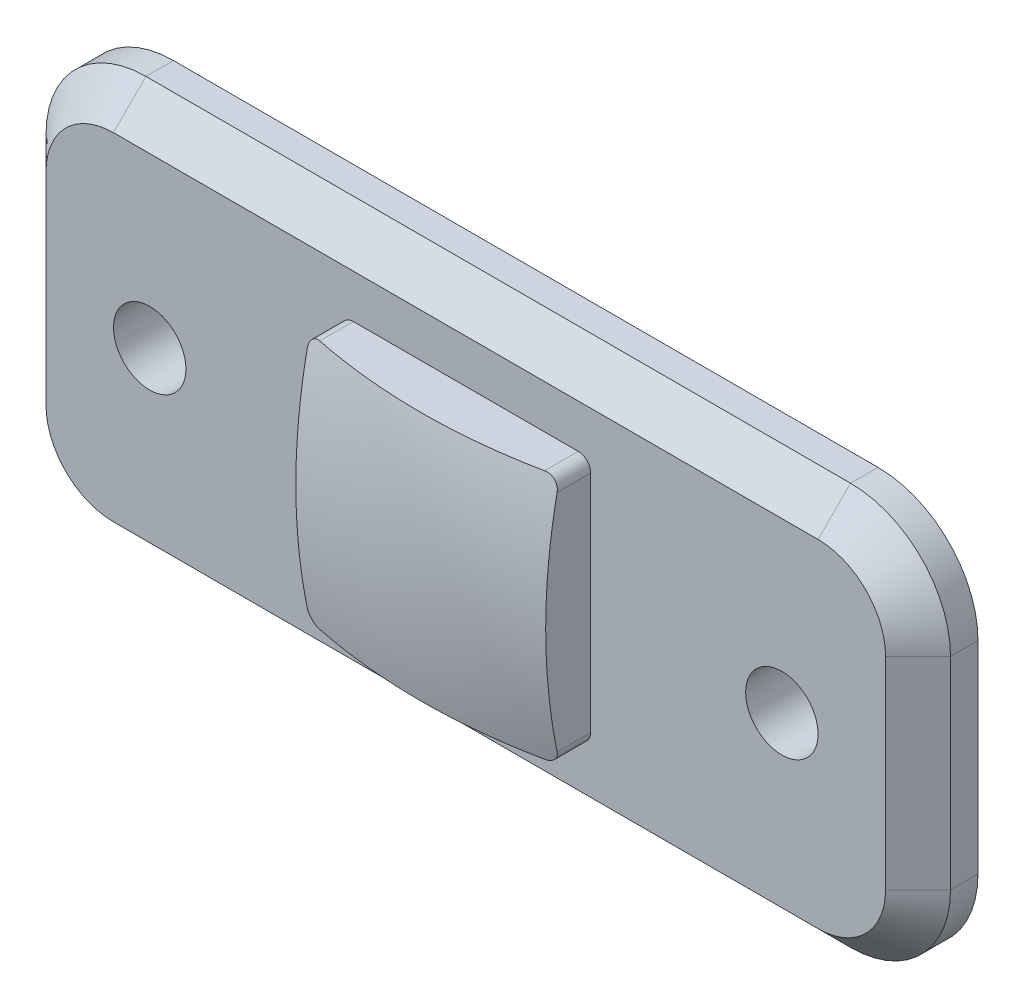
ISO-10303-21;
HEADER;
FILE_DESCRIPTION(('STEP AP214'),'2;1');
FILE_NAME('part.step','',(''),(''),'','','');
FILE_SCHEMA(('AUTOMOTIVE_DESIGN { 1 0 10303 214 1 1 1 1 }'));
ENDSEC;
DATA;
#1=APPLICATION_CONTEXT('core data for automotive mechanical design processes');
#2=APPLICATION_PROTOCOL_DEFINITION('international standard','automotive_design',2000,#1);
#3=PRODUCT_CONTEXT('',#1,'mechanical');
#4=PRODUCT('Part','Part','',(#3));
#5=PRODUCT_RELATED_PRODUCT_CATEGORY('part','',(#4));
#6=PRODUCT_DEFINITION_FORMATION('','',#4);
#7=PRODUCT_DEFINITION_CONTEXT('part definition',#1,'design');
#8=PRODUCT_DEFINITION('design','',#6,#7);
#9=PRODUCT_DEFINITION_SHAPE('','',#8);
#10=(LENGTH_UNIT() NAMED_UNIT(*) SI_UNIT(.MILLI.,.METRE.));
#11=(NAMED_UNIT(*) PLANE_ANGLE_UNIT() SI_UNIT($,.RADIAN.));
#12=(NAMED_UNIT(*) SI_UNIT($,.STERADIAN.) SOLID_ANGLE_UNIT());
#13=UNCERTAINTY_MEASURE_WITH_UNIT(LENGTH_MEASURE(1.E-05),#10,'distance_accuracy_value','');
#14=(GEOMETRIC_REPRESENTATION_CONTEXT(3) GLOBAL_UNCERTAINTY_ASSIGNED_CONTEXT((#13)) GLOBAL_UNIT_ASSIGNED_CONTEXT((#10,
#11,#12)) REPRESENTATION_CONTEXT('',''));
#15=CARTESIAN_POINT('',(0.,0.,0.));
#16=DIRECTION('',(0.,0.,1.));
#17=DIRECTION('',(1.,0.,0.));
#18=AXIS2_PLACEMENT_3D('',#15,#16,#17);
#19=CARTESIAN_POINT('',(-4.5,5.,4.75));
#20=DIRECTION('',(0.,-1.,0.));
#21=DIRECTION('',(0.,0.,-1.));
#22=AXIS2_PLACEMENT_3D('',#19,#20,#21);
#23=PLANE('',#22);
#24=DIRECTION('',(0.,0.,-1.));
#25=VECTOR('',#24,1.);
#26=CARTESIAN_POINT('',(-4.5,5.,4.75));
#27=LINE('',#26,#25);
#28=CARTESIAN_POINT('',(-4.5,5.,3.74442135660803));
#29=VERTEX_POINT('',#28);
#30=CARTESIAN_POINT('',(-4.5,5.,2.4));
#31=VERTEX_POINT('',#30);
#32=EDGE_CURVE('E235',#29,#31,#27,.T.);
#33=ORIENTED_EDGE('',*,*,#32,.F.);
#34=CARTESIAN_POINT('',(0.,5.,-18.2522727272727));
#35=DIRECTION('',(0.,-1.,0.));
#36=DIRECTION('',(0.,0.,-1.));
#37=AXIS2_PLACEMENT_3D('',#34,#35,#36);
#38=CIRCLE('',#37,22.4522727272727);
#39=CARTESIAN_POINT('',(4.5,5.,3.74442135660804));
#40=VERTEX_POINT('',#39);
#41=EDGE_CURVE('E207',#29,#40,#38,.F.);
#42=ORIENTED_EDGE('',*,*,#41,.T.);
#43=DIRECTION('',(0.,0.,-1.));
#44=VECTOR('',#43,1.);
#45=CARTESIAN_POINT('',(4.5,5.,4.75));
#46=LINE('',#45,#44);
#47=CARTESIAN_POINT('',(4.5,5.,2.4));
#48=VERTEX_POINT('',#47);
#49=EDGE_CURVE('E204',#40,#48,#46,.T.);
#50=ORIENTED_EDGE('',*,*,#49,.T.);
#51=DIRECTION('',(-1.,0.,0.));
#52=VECTOR('',#51,1.);
#53=CARTESIAN_POINT('',(-4.5,5.,2.4));
#54=LINE('',#53,#52);
#55=EDGE_CURVE('E505',#48,#31,#54,.T.);
#56=ORIENTED_EDGE('',*,*,#55,.T.);
#57=EDGE_LOOP('',(#33,#42,#50,#56));
#58=FACE_BOUND('',#57,.T.);
#59=ADVANCED_FACE('F43',(#58),#23,.F.);
#60=CARTESIAN_POINT('',(-5.,4.49999999999999,4.75));
#61=DIRECTION('',(1.,0.,0.));
#62=DIRECTION('',(0.,1.,0.));
#63=AXIS2_PLACEMENT_3D('',#60,#61,#62);
#64=PLANE('',#63);
#65=DIRECTION('',(0.,0.,-1.));
#66=VECTOR('',#65,1.);
#67=CARTESIAN_POINT('',(-5.,-4.5,4.75));
#68=LINE('',#67,#66);
#69=CARTESIAN_POINT('',(-5.,-4.5,3.74442135660803));
#70=VERTEX_POINT('',#69);
#71=CARTESIAN_POINT('',(-5.,-4.5,2.4));
#72=VERTEX_POINT('',#71);
#73=EDGE_CURVE('E229',#70,#72,#68,.T.);
#74=ORIENTED_EDGE('',*,*,#73,.F.);
#75=CARTESIAN_POINT('',(-5.,0.,-18.2522727272727));
#76=DIRECTION('',(1.,0.,0.));
#77=DIRECTION('',(0.,1.,0.));
#78=AXIS2_PLACEMENT_3D('',#75,#76,#77);
#79=CIRCLE('',#78,22.4522727272727);
#80=CARTESIAN_POINT('',(-5.,4.49999999999999,3.74442135660803));
#81=VERTEX_POINT('',#80);
#82=EDGE_CURVE('E465',#70,#81,#79,.F.);
#83=ORIENTED_EDGE('',*,*,#82,.T.);
#84=DIRECTION('',(0.,0.,-1.));
#85=VECTOR('',#84,1.);
#86=CARTESIAN_POINT('',(-5.,4.49999999999999,4.75));
#87=LINE('',#86,#85);
#88=CARTESIAN_POINT('',(-5.,4.49999999999999,2.4));
#89=VERTEX_POINT('',#88);
#90=EDGE_CURVE('E232',#81,#89,#87,.T.);
#91=ORIENTED_EDGE('',*,*,#90,.T.);
#92=DIRECTION('',(0.,-1.,0.));
#93=VECTOR('',#92,1.);
#94=CARTESIAN_POINT('',(-5.,4.49999999999999,2.4));
#95=LINE('',#94,#93);
#96=EDGE_CURVE('E498',#89,#72,#95,.T.);
#97=ORIENTED_EDGE('',*,*,#96,.T.);
#98=EDGE_LOOP('',(#74,#83,#91,#97));
#99=FACE_BOUND('',#98,.T.);
#100=ADVANCED_FACE('F405',(#99),#64,.F.);
#101=CARTESIAN_POINT('',(-4.5,-5.,4.75));
#102=DIRECTION('',(0.,1.,0.));
#103=DIRECTION('',(0.,0.,1.));
#104=AXIS2_PLACEMENT_3D('',#101,#102,#103);
#105=PLANE('',#104);
#106=DIRECTION('',(0.,0.,-1.));
#107=VECTOR('',#106,1.);
#108=CARTESIAN_POINT('',(4.5,-5.,4.75));
#109=LINE('',#108,#107);
#110=CARTESIAN_POINT('',(4.5,-5.,3.74442135660803));
#111=VERTEX_POINT('',#110);
#112=CARTESIAN_POINT('',(4.5,-5.,2.4));
#113=VERTEX_POINT('',#112);
#114=EDGE_CURVE('E218',#111,#113,#109,.T.);
#115=ORIENTED_EDGE('',*,*,#114,.F.);
#116=CARTESIAN_POINT('',(0.,-5.,-18.2522727272727));
#117=DIRECTION('',(0.,1.,0.));
#118=DIRECTION('',(0.,0.,1.));
#119=AXIS2_PLACEMENT_3D('',#116,#117,#118);
#120=CIRCLE('',#119,22.4522727272727);
#121=CARTESIAN_POINT('',(-4.5,-5.,3.74442135660803));
#122=VERTEX_POINT('',#121);
#123=EDGE_CURVE('E472',#111,#122,#120,.F.);
#124=ORIENTED_EDGE('',*,*,#123,.T.);
#125=DIRECTION('',(0.,0.,-1.));
#126=VECTOR('',#125,1.);
#127=CARTESIAN_POINT('',(-4.5,-5.,4.75));
#128=LINE('',#127,#126);
#129=CARTESIAN_POINT('',(-4.5,-5.,2.4));
#130=VERTEX_POINT('',#129);
#131=EDGE_CURVE('E226',#122,#130,#128,.T.);
#132=ORIENTED_EDGE('',*,*,#131,.T.);
#133=DIRECTION('',(1.,0.,0.));
#134=VECTOR('',#133,1.);
#135=CARTESIAN_POINT('',(-4.5,-5.,2.4));
#136=LINE('',#135,#134);
#137=EDGE_CURVE('E484',#130,#113,#136,.T.);
#138=ORIENTED_EDGE('',*,*,#137,.T.);
#139=EDGE_LOOP('',(#115,#124,#132,#138));
#140=FACE_BOUND('',#139,.T.);
#141=ADVANCED_FACE('F411',(#140),#105,.F.);
#142=CARTESIAN_POINT('',(5.,4.5,4.75));
#143=DIRECTION('',(-1.,0.,0.));
#144=DIRECTION('',(0.,-1.,0.));
#145=AXIS2_PLACEMENT_3D('',#142,#143,#144);
#146=PLANE('',#145);
#147=DIRECTION('',(0.,0.,-1.));
#148=VECTOR('',#147,1.);
#149=CARTESIAN_POINT('',(5.,4.5,4.75));
#150=LINE('',#149,#148);
#151=CARTESIAN_POINT('',(5.,4.5,3.74442135660804));
#152=VERTEX_POINT('',#151);
#153=CARTESIAN_POINT('',(5.,4.5,2.4));
#154=VERTEX_POINT('',#153);
#155=EDGE_CURVE('E202',#152,#154,#150,.T.);
#156=ORIENTED_EDGE('',*,*,#155,.F.);
#157=CARTESIAN_POINT('',(5.,0.,-18.2522727272727));
#158=DIRECTION('',(-1.,0.,0.));
#159=DIRECTION('',(0.,-1.,0.));
#160=AXIS2_PLACEMENT_3D('',#157,#158,#159);
#161=CIRCLE('',#160,22.4522727272727);
#162=CARTESIAN_POINT('',(5.,-4.5,3.74442135660804));
#163=VERTEX_POINT('',#162);
#164=EDGE_CURVE('E184',#152,#163,#161,.F.);
#165=ORIENTED_EDGE('',*,*,#164,.T.);
#166=DIRECTION('',(0.,0.,-1.));
#167=VECTOR('',#166,1.);
#168=CARTESIAN_POINT('',(5.,-4.5,4.75));
#169=LINE('',#168,#167);
#170=CARTESIAN_POINT('',(5.,-4.5,2.4));
#171=VERTEX_POINT('',#170);
#172=EDGE_CURVE('E214',#163,#171,#169,.T.);
#173=ORIENTED_EDGE('',*,*,#172,.T.);
#174=DIRECTION('',(0.,1.,0.));
#175=VECTOR('',#174,1.);
#176=CARTESIAN_POINT('',(5.,4.5,2.4));
#177=LINE('',#176,#175);
#178=EDGE_CURVE('E211',#171,#154,#177,.T.);
#179=ORIENTED_EDGE('',*,*,#178,.T.);
#180=EDGE_LOOP('',(#156,#165,#173,#179));
#181=FACE_BOUND('',#180,.T.);
#182=ADVANCED_FACE('F209',(#181),#146,.F.);
#183=CARTESIAN_POINT('',(-14.1,-4.045,2.4));
#184=DIRECTION('',(0.,0.,1.));
#185=DIRECTION('',(1.,0.,0.));
#186=AXIS2_PLACEMENT_3D('',#183,#184,#185);
#187=PLANE('',#186);
#188=DIRECTION('',(0.,-1.,0.));
#189=VECTOR('',#188,1.);
#190=CARTESIAN_POINT('',(-16.8,-4.04499999999997,2.4));
#191=LINE('',#190,#189);
#192=CARTESIAN_POINT('',(-16.8,4.04499999999997,2.4));
#193=VERTEX_POINT('',#192);
#194=CARTESIAN_POINT('',(-16.8,-4.04499999999998,2.4));
#195=VERTEX_POINT('',#194);
#196=EDGE_CURVE('E328',#193,#195,#191,.T.);
#197=ORIENTED_EDGE('',*,*,#196,.T.);
#198=CARTESIAN_POINT('',(-14.1,-4.045,2.4));
#199=DIRECTION('',(0.,0.,1.));
#200=DIRECTION('',(1.,0.,0.));
#201=AXIS2_PLACEMENT_3D('',#198,#199,#200);
#202=CIRCLE('',#201,2.7);
#203=CARTESIAN_POINT('',(-14.1,-6.745,2.4));
#204=VERTEX_POINT('',#203);
#205=EDGE_CURVE('E331',#195,#204,#202,.T.);
#206=ORIENTED_EDGE('',*,*,#205,.T.);
#207=DIRECTION('',(1.,0.,0.));
#208=VECTOR('',#207,1.);
#209=CARTESIAN_POINT('',(14.1,-6.745,2.4));
#210=LINE('',#209,#208);
#211=CARTESIAN_POINT('',(14.1,-6.745,2.4));
#212=VERTEX_POINT('',#211);
#213=EDGE_CURVE('E195',#204,#212,#210,.T.);
#214=ORIENTED_EDGE('',*,*,#213,.T.);
#215=CARTESIAN_POINT('',(14.1,-4.045,2.4));
#216=DIRECTION('',(0.,0.,1.));
#217=DIRECTION('',(1.,0.,0.));
#218=AXIS2_PLACEMENT_3D('',#215,#216,#217);
#219=CIRCLE('',#218,2.7);
#220=CARTESIAN_POINT('',(16.8,-4.04499999999997,2.4));
#221=VERTEX_POINT('',#220);
#222=EDGE_CURVE('E313',#212,#221,#219,.T.);
#223=ORIENTED_EDGE('',*,*,#222,.T.);
#224=DIRECTION('',(0.,1.,0.));
#225=VECTOR('',#224,1.);
#226=CARTESIAN_POINT('',(16.8,4.04499999999998,2.4));
#227=LINE('',#226,#225);
#228=CARTESIAN_POINT('',(16.8,4.04499999999998,2.4));
#229=VERTEX_POINT('',#228);
#230=EDGE_CURVE('E316',#221,#229,#227,.T.);
#231=ORIENTED_EDGE('',*,*,#230,.T.);
#232=CARTESIAN_POINT('',(14.1,4.045,2.4));
#233=DIRECTION('',(0.,0.,1.));
#234=DIRECTION('',(1.,0.,0.));
#235=AXIS2_PLACEMENT_3D('',#232,#233,#234);
#236=CIRCLE('',#235,2.70000000000001);
#237=CARTESIAN_POINT('',(14.1,6.74500000000001,2.4));
#238=VERTEX_POINT('',#237);
#239=EDGE_CURVE('E319',#229,#238,#236,.T.);
#240=ORIENTED_EDGE('',*,*,#239,.T.);
#241=DIRECTION('',(-1.,0.,0.));
#242=VECTOR('',#241,1.);
#243=CARTESIAN_POINT('',(-14.1,6.745,2.4));
#244=LINE('',#243,#242);
#245=CARTESIAN_POINT('',(-14.1,6.745,2.4));
#246=VERTEX_POINT('',#245);
#247=EDGE_CURVE('E322',#238,#246,#244,.T.);
#248=ORIENTED_EDGE('',*,*,#247,.T.);
#249=CARTESIAN_POINT('',(-14.1,4.045,2.4));
#250=DIRECTION('',(0.,0.,1.));
#251=DIRECTION('',(1.,0.,0.));
#252=AXIS2_PLACEMENT_3D('',#249,#250,#251);
#253=CIRCLE('',#252,2.7);
#254=EDGE_CURVE('E325',#246,#193,#253,.T.);
#255=ORIENTED_EDGE('',*,*,#254,.T.);
#256=EDGE_LOOP('',(#197,#206,#214,#223,#231,#240,#248,#255));
#257=FACE_BOUND('',#256,.T.);
#258=CARTESIAN_POINT('',(-12.65,0.,2.4));
#259=DIRECTION('',(0.,0.,1.));
#260=DIRECTION('',(1.,0.,0.));
#261=AXIS2_PLACEMENT_3D('',#258,#259,#260);
#262=CIRCLE('',#261,1.45);
#263=CARTESIAN_POINT('',(-11.2,0.,2.4));
#264=VERTEX_POINT('',#263);
#265=EDGE_CURVE('E249',#264,#264,#262,.T.);
#266=ORIENTED_EDGE('',*,*,#265,.F.);
#267=EDGE_LOOP('',(#266));
#268=FACE_BOUND('',#267,.T.);
#269=CARTESIAN_POINT('',(12.65,0.,2.4));
#270=DIRECTION('',(0.,0.,1.));
#271=DIRECTION('',(-1.,0.,0.));
#272=AXIS2_PLACEMENT_3D('',#269,#270,#271);
#273=CIRCLE('',#272,1.45);
#274=CARTESIAN_POINT('',(11.2,0.,2.4));
#275=VERTEX_POINT('',#274);
#276=EDGE_CURVE('E241',#275,#275,#273,.T.);
#277=ORIENTED_EDGE('',*,*,#276,.F.);
#278=EDGE_LOOP('',(#277));
#279=FACE_BOUND('',#278,.T.);
#280=ORIENTED_EDGE('',*,*,#55,.F.);
#281=CARTESIAN_POINT('',(4.5,4.5,2.4));
#282=DIRECTION('',(0.,0.,1.));
#283=DIRECTION('',(-1.,0.,0.));
#284=AXIS2_PLACEMENT_3D('',#281,#282,#283);
#285=CIRCLE('',#284,0.5);
#286=EDGE_CURVE('E206',#154,#48,#285,.T.);
#287=ORIENTED_EDGE('',*,*,#286,.F.);
#288=ORIENTED_EDGE('',*,*,#178,.F.);
#289=CARTESIAN_POINT('',(4.5,-4.5,2.4));
#290=DIRECTION('',(0.,0.,1.));
#291=DIRECTION('',(1.,0.,0.));
#292=AXIS2_PLACEMENT_3D('',#289,#290,#291);
#293=CIRCLE('',#292,0.5);
#294=EDGE_CURVE('E220',#113,#171,#293,.T.);
#295=ORIENTED_EDGE('',*,*,#294,.F.);
#296=ORIENTED_EDGE('',*,*,#137,.F.);
#297=CARTESIAN_POINT('',(-4.5,-4.5,2.4));
#298=DIRECTION('',(0.,0.,1.));
#299=DIRECTION('',(1.,0.,0.));
#300=AXIS2_PLACEMENT_3D('',#297,#298,#299);
#301=CIRCLE('',#300,0.5);
#302=EDGE_CURVE('E490',#72,#130,#301,.T.);
#303=ORIENTED_EDGE('',*,*,#302,.F.);
#304=ORIENTED_EDGE('',*,*,#96,.F.);
#305=CARTESIAN_POINT('',(-4.5,4.5,2.4));
#306=DIRECTION('',(0.,0.,1.));
#307=DIRECTION('',(1.,0.,0.));
#308=AXIS2_PLACEMENT_3D('',#305,#306,#307);
#309=CIRCLE('',#308,0.5);
#310=EDGE_CURVE('E502',#31,#89,#309,.T.);
#311=ORIENTED_EDGE('',*,*,#310,.F.);
#312=EDGE_LOOP('',(#280,#287,#288,#295,#296,#303,#304,#311));
#313=FACE_BOUND('',#312,.T.);
#314=ADVANCED_FACE('F493',(#257,#268,#279,#313),#187,.T.);
#315=CARTESIAN_POINT('',(-14.1,-4.045,0.));
#316=DIRECTION('',(0.,0.,1.));
#317=DIRECTION('',(1.,0.,0.));
#318=AXIS2_PLACEMENT_3D('',#315,#316,#317);
#319=PLANE('',#318);
#320=CARTESIAN_POINT('',(0.,0.,0.));
#321=DIRECTION('',(0.,0.,1.));
#322=DIRECTION('',(1.,0.,0.));
#323=AXIS2_PLACEMENT_3D('',#320,#321,#322);
#324=CIRCLE('',#323,5.74458223024094);
#325=CARTESIAN_POINT('',(5.74458223024094,0.,0.));
#326=VERTEX_POINT('',#325);
#327=EDGE_CURVE('E52',#326,#326,#324,.T.);
#328=ORIENTED_EDGE('',*,*,#327,.T.);
#329=EDGE_LOOP('',(#328));
#330=FACE_BOUND('',#329,.T.);
#331=CARTESIAN_POINT('',(-14.1,-4.045,0.));
#332=DIRECTION('',(0.,0.,1.));
#333=DIRECTION('',(1.,0.,0.));
#334=AXIS2_PLACEMENT_3D('',#331,#332,#333);
#335=CIRCLE('',#334,4.);
#336=CARTESIAN_POINT('',(-18.1,-4.04499999999997,0.));
#337=VERTEX_POINT('',#336);
#338=CARTESIAN_POINT('',(-14.1,-8.045,0.));
#339=VERTEX_POINT('',#338);
#340=EDGE_CURVE('E253',#337,#339,#335,.T.);
#341=ORIENTED_EDGE('',*,*,#340,.F.);
#342=DIRECTION('',(0.,-1.,0.));
#343=VECTOR('',#342,1.);
#344=CARTESIAN_POINT('',(-18.1,4.04499999999997,0.));
#345=LINE('',#344,#343);
#346=CARTESIAN_POINT('',(-18.1,4.04499999999997,0.));
#347=VERTEX_POINT('',#346);
#348=EDGE_CURVE('E284',#347,#337,#345,.T.);
#349=ORIENTED_EDGE('',*,*,#348,.F.);
#350=CARTESIAN_POINT('',(-14.1,4.045,0.));
#351=DIRECTION('',(0.,0.,1.));
#352=DIRECTION('',(1.,0.,0.));
#353=AXIS2_PLACEMENT_3D('',#350,#351,#352);
#354=CIRCLE('',#353,4.);
#355=CARTESIAN_POINT('',(-14.1,8.045,0.));
#356=VERTEX_POINT('',#355);
#357=EDGE_CURVE('E280',#356,#347,#354,.T.);
#358=ORIENTED_EDGE('',*,*,#357,.F.);
#359=DIRECTION('',(-1.,0.,0.));
#360=VECTOR('',#359,1.);
#361=CARTESIAN_POINT('',(-14.1,8.045,0.));
#362=LINE('',#361,#360);
#363=CARTESIAN_POINT('',(14.1,8.045,0.));
#364=VERTEX_POINT('',#363);
#365=EDGE_CURVE('E276',#364,#356,#362,.T.);
#366=ORIENTED_EDGE('',*,*,#365,.F.);
#367=CARTESIAN_POINT('',(14.1,4.045,0.));
#368=DIRECTION('',(0.,0.,1.));
#369=DIRECTION('',(-1.,0.,0.));
#370=AXIS2_PLACEMENT_3D('',#367,#368,#369);
#371=CIRCLE('',#370,4.);
#372=CARTESIAN_POINT('',(18.1,4.04499999999998,0.));
#373=VERTEX_POINT('',#372);
#374=EDGE_CURVE('E272',#373,#364,#371,.T.);
#375=ORIENTED_EDGE('',*,*,#374,.F.);
#376=DIRECTION('',(0.,1.,0.));
#377=VECTOR('',#376,1.);
#378=CARTESIAN_POINT('',(18.1,4.04499999999997,0.));
#379=LINE('',#378,#377);
#380=CARTESIAN_POINT('',(18.1,-4.04499999999997,0.));
#381=VERTEX_POINT('',#380);
#382=EDGE_CURVE('E268',#381,#373,#379,.T.);
#383=ORIENTED_EDGE('',*,*,#382,.F.);
#384=CARTESIAN_POINT('',(14.1,-4.045,0.));
#385=DIRECTION('',(0.,0.,1.));
#386=DIRECTION('',(1.,0.,0.));
#387=AXIS2_PLACEMENT_3D('',#384,#385,#386);
#388=CIRCLE('',#387,4.);
#389=CARTESIAN_POINT('',(14.1,-8.045,0.));
#390=VERTEX_POINT('',#389);
#391=EDGE_CURVE('E264',#390,#381,#388,.T.);
#392=ORIENTED_EDGE('',*,*,#391,.F.);
#393=DIRECTION('',(1.,0.,0.));
#394=VECTOR('',#393,1.);
#395=CARTESIAN_POINT('',(-14.1,-8.045,0.));
#396=LINE('',#395,#394);
#397=EDGE_CURVE('E260',#339,#390,#396,.T.);
#398=ORIENTED_EDGE('',*,*,#397,.F.);
#399=EDGE_LOOP('',(#341,#349,#358,#366,#375,#383,#392,#398));
#400=FACE_BOUND('',#399,.T.);
#401=CARTESIAN_POINT('',(-12.65,0.,0.));
#402=DIRECTION('',(0.,0.,1.));
#403=DIRECTION('',(1.,0.,0.));
#404=AXIS2_PLACEMENT_3D('',#401,#402,#403);
#405=CIRCLE('',#404,1.45);
#406=CARTESIAN_POINT('',(-11.2,0.,0.));
#407=VERTEX_POINT('',#406);
#408=EDGE_CURVE('E245',#407,#407,#405,.T.);
#409=ORIENTED_EDGE('',*,*,#408,.T.);
#410=EDGE_LOOP('',(#409));
#411=FACE_BOUND('',#410,.T.);
#412=CARTESIAN_POINT('',(12.65,0.,0.));
#413=DIRECTION('',(0.,0.,1.));
#414=DIRECTION('',(-1.,0.,0.));
#415=AXIS2_PLACEMENT_3D('',#412,#413,#414);
#416=CIRCLE('',#415,1.45);
#417=CARTESIAN_POINT('',(11.2,0.,0.));
#418=VERTEX_POINT('',#417);
#419=EDGE_CURVE('E240',#418,#418,#416,.T.);
#420=ORIENTED_EDGE('',*,*,#419,.T.);
#421=EDGE_LOOP('',(#420));
#422=FACE_BOUND('',#421,.T.);
#423=ADVANCED_FACE('F391',(#330,#400,#411,#422),#319,.F.);
#424=CARTESIAN_POINT('',(-14.1,-4.045,2.4));
#425=DIRECTION('',(0.,0.,-1.));
#426=DIRECTION('',(-1.,0.,0.));
#427=AXIS2_PLACEMENT_3D('',#424,#425,#426);
#428=CYLINDRICAL_SURFACE('',#427,4.);
#429=DIRECTION('',(0.,0.,-1.));
#430=VECTOR('',#429,1.);
#431=CARTESIAN_POINT('',(-14.1,-8.045,2.4));
#432=LINE('',#431,#430);
#433=CARTESIAN_POINT('',(-14.1,-8.045,1.1));
#434=VERTEX_POINT('',#433);
#435=EDGE_CURVE('E196',#434,#339,#432,.T.);
#436=ORIENTED_EDGE('',*,*,#435,.F.);
#437=CARTESIAN_POINT('',(-14.1,-4.045,1.1));
#438=DIRECTION('',(0.,0.,1.));
#439=DIRECTION('',(1.,0.,0.));
#440=AXIS2_PLACEMENT_3D('',#437,#438,#439);
#441=CIRCLE('',#440,4.);
#442=CARTESIAN_POINT('',(-18.1,-4.04499999999997,1.1));
#443=VERTEX_POINT('',#442);
#444=EDGE_CURVE('E335',#434,#443,#441,.F.);
#445=ORIENTED_EDGE('',*,*,#444,.T.);
#446=DIRECTION('',(0.,0.,-1.));
#447=VECTOR('',#446,1.);
#448=CARTESIAN_POINT('',(-18.1,-4.04499999999997,2.4));
#449=LINE('',#448,#447);
#450=EDGE_CURVE('E288',#443,#337,#449,.T.);
#451=ORIENTED_EDGE('',*,*,#450,.T.);
#452=ORIENTED_EDGE('',*,*,#340,.T.);
#453=EDGE_LOOP('',(#436,#445,#451,#452));
#454=FACE_BOUND('',#453,.T.);
#455=ADVANCED_FACE('F532',(#454),#428,.T.);
#456=CARTESIAN_POINT('',(-14.1,-8.045,2.4));
#457=DIRECTION('',(0.,1.,0.));
#458=DIRECTION('',(0.,0.,1.));
#459=AXIS2_PLACEMENT_3D('',#456,#457,#458);
#460=PLANE('',#459);
#461=DIRECTION('',(0.,0.,-1.));
#462=VECTOR('',#461,1.);
#463=CARTESIAN_POINT('',(14.1,-8.045,2.4));
#464=LINE('',#463,#462);
#465=CARTESIAN_POINT('',(14.1,-8.045,1.1));
#466=VERTEX_POINT('',#465);
#467=EDGE_CURVE('E306',#466,#390,#464,.T.);
#468=ORIENTED_EDGE('',*,*,#467,.F.);
#469=DIRECTION('',(-1.,0.,0.));
#470=VECTOR('',#469,1.);
#471=CARTESIAN_POINT('',(-14.1,-8.045,1.1));
#472=LINE('',#471,#470);
#473=EDGE_CURVE('E355',#466,#434,#472,.T.);
#474=ORIENTED_EDGE('',*,*,#473,.T.);
#475=ORIENTED_EDGE('',*,*,#435,.T.);
#476=ORIENTED_EDGE('',*,*,#397,.T.);
#477=EDGE_LOOP('',(#468,#474,#475,#476));
#478=FACE_BOUND('',#477,.T.);
#479=ADVANCED_FACE('F559',(#478),#460,.F.);
#480=CARTESIAN_POINT('',(14.1,-4.045,2.4));
#481=DIRECTION('',(0.,0.,-1.));
#482=DIRECTION('',(-1.,0.,0.));
#483=AXIS2_PLACEMENT_3D('',#480,#481,#482);
#484=CYLINDRICAL_SURFACE('',#483,4.);
#485=DIRECTION('',(0.,0.,-1.));
#486=VECTOR('',#485,1.);
#487=CARTESIAN_POINT('',(18.1,-4.04499999999997,2.4));
#488=LINE('',#487,#486);
#489=CARTESIAN_POINT('',(18.1,-4.04499999999997,1.1));
#490=VERTEX_POINT('',#489);
#491=EDGE_CURVE('E303',#490,#381,#488,.T.);
#492=ORIENTED_EDGE('',*,*,#491,.F.);
#493=CARTESIAN_POINT('',(14.1,-4.045,1.1));
#494=DIRECTION('',(0.,0.,1.));
#495=DIRECTION('',(1.,0.,0.));
#496=AXIS2_PLACEMENT_3D('',#493,#494,#495);
#497=CIRCLE('',#496,4.);
#498=EDGE_CURVE('E59',#490,#466,#497,.F.);
#499=ORIENTED_EDGE('',*,*,#498,.T.);
#500=ORIENTED_EDGE('',*,*,#467,.T.);
#501=ORIENTED_EDGE('',*,*,#391,.T.);
#502=EDGE_LOOP('',(#492,#499,#500,#501));
#503=FACE_BOUND('',#502,.T.);
#504=ADVANCED_FACE('F556',(#503),#484,.T.);
#505=CARTESIAN_POINT('',(18.1,4.04499999999997,2.4));
#506=DIRECTION('',(-1.,0.,0.));
#507=DIRECTION('',(0.,-1.,0.));
#508=AXIS2_PLACEMENT_3D('',#505,#506,#507);
#509=PLANE('',#508);
#510=DIRECTION('',(0.,0.,-1.));
#511=VECTOR('',#510,1.);
#512=CARTESIAN_POINT('',(18.1,4.04499999999998,2.4));
#513=LINE('',#512,#511);
#514=CARTESIAN_POINT('',(18.1,4.04499999999998,1.1));
#515=VERTEX_POINT('',#514);
#516=EDGE_CURVE('E300',#515,#373,#513,.T.);
#517=ORIENTED_EDGE('',*,*,#516,.F.);
#518=DIRECTION('',(0.,-1.,0.));
#519=VECTOR('',#518,1.);
#520=CARTESIAN_POINT('',(18.1,-4.04499999999997,1.1));
#521=LINE('',#520,#519);
#522=EDGE_CURVE('E67',#515,#490,#521,.T.);
#523=ORIENTED_EDGE('',*,*,#522,.T.);
#524=ORIENTED_EDGE('',*,*,#491,.T.);
#525=ORIENTED_EDGE('',*,*,#382,.T.);
#526=EDGE_LOOP('',(#517,#523,#524,#525));
#527=FACE_BOUND('',#526,.T.);
#528=ADVANCED_FACE('F552',(#527),#509,.F.);
#529=CARTESIAN_POINT('',(14.1,4.045,2.4));
#530=DIRECTION('',(0.,0.,-1.));
#531=DIRECTION('',(-1.,0.,0.));
#532=AXIS2_PLACEMENT_3D('',#529,#530,#531);
#533=CYLINDRICAL_SURFACE('',#532,4.);
#534=DIRECTION('',(0.,0.,-1.));
#535=VECTOR('',#534,1.);
#536=CARTESIAN_POINT('',(14.1,8.045,2.4));
#537=LINE('',#536,#535);
#538=CARTESIAN_POINT('',(14.1,8.045,1.1));
#539=VERTEX_POINT('',#538);
#540=EDGE_CURVE('E297',#539,#364,#537,.T.);
#541=ORIENTED_EDGE('',*,*,#540,.F.);
#542=CARTESIAN_POINT('',(14.1,4.045,1.1));
#543=DIRECTION('',(0.,0.,1.));
#544=DIRECTION('',(1.,0.,0.));
#545=AXIS2_PLACEMENT_3D('',#542,#543,#544);
#546=CIRCLE('',#545,4.);
#547=EDGE_CURVE('E348',#539,#515,#546,.F.);
#548=ORIENTED_EDGE('',*,*,#547,.T.);
#549=ORIENTED_EDGE('',*,*,#516,.T.);
#550=ORIENTED_EDGE('',*,*,#374,.T.);
#551=EDGE_LOOP('',(#541,#548,#549,#550));
#552=FACE_BOUND('',#551,.T.);
#553=ADVANCED_FACE('F548',(#552),#533,.T.);
#554=CARTESIAN_POINT('',(-14.1,8.045,2.4));
#555=DIRECTION('',(0.,-1.,0.));
#556=DIRECTION('',(0.,0.,-1.));
#557=AXIS2_PLACEMENT_3D('',#554,#555,#556);
#558=PLANE('',#557);
#559=DIRECTION('',(0.,0.,-1.));
#560=VECTOR('',#559,1.);
#561=CARTESIAN_POINT('',(-14.1,8.045,2.4));
#562=LINE('',#561,#560);
#563=CARTESIAN_POINT('',(-14.1,8.045,1.1));
#564=VERTEX_POINT('',#563);
#565=EDGE_CURVE('E294',#564,#356,#562,.T.);
#566=ORIENTED_EDGE('',*,*,#565,.F.);
#567=DIRECTION('',(1.,0.,0.));
#568=VECTOR('',#567,1.);
#569=CARTESIAN_POINT('',(14.1,8.045,1.1));
#570=LINE('',#569,#568);
#571=EDGE_CURVE('E345',#564,#539,#570,.T.);
#572=ORIENTED_EDGE('',*,*,#571,.T.);
#573=ORIENTED_EDGE('',*,*,#540,.T.);
#574=ORIENTED_EDGE('',*,*,#365,.T.);
#575=EDGE_LOOP('',(#566,#572,#573,#574));
#576=FACE_BOUND('',#575,.T.);
#577=ADVANCED_FACE('F544',(#576),#558,.F.);
#578=CARTESIAN_POINT('',(-14.1,4.045,2.4));
#579=DIRECTION('',(0.,0.,-1.));
#580=DIRECTION('',(-1.,0.,0.));
#581=AXIS2_PLACEMENT_3D('',#578,#579,#580);
#582=CYLINDRICAL_SURFACE('',#581,4.);
#583=DIRECTION('',(0.,0.,-1.));
#584=VECTOR('',#583,1.);
#585=CARTESIAN_POINT('',(-18.1,4.04499999999997,2.4));
#586=LINE('',#585,#584);
#587=CARTESIAN_POINT('',(-18.1,4.04499999999997,1.1));
#588=VERTEX_POINT('',#587);
#589=EDGE_CURVE('E291',#588,#347,#586,.T.);
#590=ORIENTED_EDGE('',*,*,#589,.F.);
#591=CARTESIAN_POINT('',(-14.1,4.045,1.1));
#592=DIRECTION('',(0.,0.,1.));
#593=DIRECTION('',(1.,0.,0.));
#594=AXIS2_PLACEMENT_3D('',#591,#592,#593);
#595=CIRCLE('',#594,4.);
#596=EDGE_CURVE('E342',#588,#564,#595,.F.);
#597=ORIENTED_EDGE('',*,*,#596,.T.);
#598=ORIENTED_EDGE('',*,*,#565,.T.);
#599=ORIENTED_EDGE('',*,*,#357,.T.);
#600=EDGE_LOOP('',(#590,#597,#598,#599));
#601=FACE_BOUND('',#600,.T.);
#602=ADVANCED_FACE('F540',(#601),#582,.T.);
#603=CARTESIAN_POINT('',(-18.1,4.04499999999997,2.4));
#604=DIRECTION('',(1.,0.,0.));
#605=DIRECTION('',(0.,1.,0.));
#606=AXIS2_PLACEMENT_3D('',#603,#604,#605);
#607=PLANE('',#606);
#608=ORIENTED_EDGE('',*,*,#450,.F.);
#609=DIRECTION('',(0.,1.,0.));
#610=VECTOR('',#609,1.);
#611=CARTESIAN_POINT('',(-18.1,4.04499999999997,1.1));
#612=LINE('',#611,#610);
#613=EDGE_CURVE('E339',#443,#588,#612,.T.);
#614=ORIENTED_EDGE('',*,*,#613,.T.);
#615=ORIENTED_EDGE('',*,*,#589,.T.);
#616=ORIENTED_EDGE('',*,*,#348,.T.);
#617=EDGE_LOOP('',(#608,#614,#615,#616));
#618=FACE_BOUND('',#617,.T.);
#619=ADVANCED_FACE('F537',(#618),#607,.F.);
#620=CARTESIAN_POINT('',(-12.65,0.,2.4));
#621=DIRECTION('',(0.,0.,-1.));
#622=DIRECTION('',(-1.,0.,0.));
#623=AXIS2_PLACEMENT_3D('',#620,#621,#622);
#624=CYLINDRICAL_SURFACE('',#623,1.45);
#625=ORIENTED_EDGE('',*,*,#265,.T.);
#626=EDGE_LOOP('',(#625));
#627=FACE_BOUND('',#626,.T.);
#628=ORIENTED_EDGE('',*,*,#408,.F.);
#629=EDGE_LOOP('',(#628));
#630=FACE_BOUND('',#629,.T.);
#631=ADVANCED_FACE('F535',(#627,#630),#624,.F.);
#632=CARTESIAN_POINT('',(12.65,0.,2.4));
#633=DIRECTION('',(0.,0.,-1.));
#634=DIRECTION('',(-1.,0.,0.));
#635=AXIS2_PLACEMENT_3D('',#632,#633,#634);
#636=CYLINDRICAL_SURFACE('',#635,1.45);
#637=ORIENTED_EDGE('',*,*,#276,.T.);
#638=EDGE_LOOP('',(#637));
#639=FACE_BOUND('',#638,.T.);
#640=ORIENTED_EDGE('',*,*,#419,.F.);
#641=EDGE_LOOP('',(#640));
#642=FACE_BOUND('',#641,.T.);
#643=ADVANCED_FACE('F422',(#639,#642),#636,.F.);
#644=CARTESIAN_POINT('',(4.5,4.5,4.75));
#645=DIRECTION('',(0.,0.,-1.));
#646=DIRECTION('',(-1.,0.,0.));
#647=AXIS2_PLACEMENT_3D('',#644,#645,#646);
#648=CYLINDRICAL_SURFACE('',#647,0.5);
#649=ORIENTED_EDGE('',*,*,#49,.F.);
#650=CARTESIAN_POINT('',(4.4998,4.99999996,3.74446227999222));
#651=CARTESIAN_POINT('',(4.52712890906599,5.00003580454716,3.73886410260589));
#652=CARTESIAN_POINT('',(4.55455945901085,4.99778204076123,3.73371140963627));
#653=CARTESIAN_POINT('',(4.60886027497063,4.98877459005618,3.72443900495739));
#654=CARTESIAN_POINT('',(4.63573031933086,4.98201915646182,3.72031969506132));
#655=CARTESIAN_POINT('',(4.6881600910841,4.96407545166903,3.71325579503127));
#656=CARTESIAN_POINT('',(4.71371796945669,4.95288110914642,3.71031282495461));
#657=CARTESIAN_POINT('',(4.76268969995784,4.92634339776069,3.70571575286355));
#658=CARTESIAN_POINT('',(4.78610488443191,4.91100263097022,3.70406084504897));
#659=CARTESIAN_POINT('',(4.82959708969446,4.87697671308804,3.7021206216522));
#660=CARTESIAN_POINT('',(4.8497362613001,4.85837264032001,3.70180595119613));
#661=CARTESIAN_POINT('',(4.88669824472796,4.81813620538156,3.70247711596019));
#662=CARTESIAN_POINT('',(4.90352083058775,4.79650363704818,3.70346303975598));
#663=CARTESIAN_POINT('',(4.93321578160699,4.75110198901164,3.70668201117709));
#664=CARTESIAN_POINT('',(4.94612880741315,4.72735847814764,3.70890148885229));
#665=CARTESIAN_POINT('',(4.96793308202369,4.67821625267031,3.71450251170765));
#666=CARTESIAN_POINT('',(4.97682420817652,4.65281748760548,3.71788409232166));
#667=CARTESIAN_POINT('',(4.98908576961524,4.60611237312023,3.72493767786682));
#668=CARTESIAN_POINT('',(4.99319230934837,4.58496721604786,3.72842629022625));
#669=CARTESIAN_POINT('',(4.99865520908744,4.54246314243316,3.73600823815355));
#670=CARTESIAN_POINT('',(5.00001557113429,4.52110458260319,3.74010068439257));
#671=CARTESIAN_POINT('',(4.99999996,4.4998,3.74446227999222));
#672=B_SPLINE_CURVE_WITH_KNOTS('',3,(#650,#651,#652,#653,#654,#655,#656,#657,#658,#659,#660,
#661,#662,#663,#664,#665,#666,#667,#668,#669,#670,#671),.UNSPECIFIED.,.F.,.F.,(4,2,2,2,2,2,2,2,
2,2,4),(0.,0.0836078118039759,0.167248082850507,0.251003149792915,0.334705778108812,
0.416565346503788,0.498430490150034,0.579412392884371,0.660396765070386,0.72568123548495,
0.790870497099178),.UNSPECIFIED.);
#673=EDGE_CURVE('E187',#40,#152,#672,.T.);
#674=ORIENTED_EDGE('',*,*,#673,.T.);
#675=ORIENTED_EDGE('',*,*,#155,.T.);
#676=ORIENTED_EDGE('',*,*,#286,.T.);
#677=EDGE_LOOP('',(#649,#674,#675,#676));
#678=FACE_BOUND('',#677,.T.);
#679=ADVANCED_FACE('F200',(#678),#648,.T.);
#680=CARTESIAN_POINT('',(-4.5,4.5,4.75));
#681=DIRECTION('',(0.,0.,-1.));
#682=DIRECTION('',(-1.,0.,0.));
#683=AXIS2_PLACEMENT_3D('',#680,#681,#682);
#684=CYLINDRICAL_SURFACE('',#683,0.5);
#685=ORIENTED_EDGE('',*,*,#90,.F.);
#686=CARTESIAN_POINT('',(-4.99999996,4.4998,3.74446227999221));
#687=CARTESIAN_POINT('',(-5.00003580454717,4.52712890906599,3.73886410260589));
#688=CARTESIAN_POINT('',(-4.99778204076123,4.55455945901085,3.73371140963627));
#689=CARTESIAN_POINT('',(-4.98877459005618,4.60886027497063,3.72443900495739));
#690=CARTESIAN_POINT('',(-4.98201915646182,4.63573031933086,3.72031969506132));
#691=CARTESIAN_POINT('',(-4.96407545166903,4.6881600910841,3.71325579503127));
#692=CARTESIAN_POINT('',(-4.95288110914643,4.71371796945669,3.71031282495461));
#693=CARTESIAN_POINT('',(-4.92634339776069,4.76268969995784,3.70571575286354));
#694=CARTESIAN_POINT('',(-4.91100263097022,4.78610488443191,3.70406084504896));
#695=CARTESIAN_POINT('',(-4.87697671308804,4.82959708969446,3.7021206216522));
#696=CARTESIAN_POINT('',(-4.85837264032002,4.8497362613001,3.70180595119614));
#697=CARTESIAN_POINT('',(-4.81813620538156,4.88669824472796,3.7024771159602));
#698=CARTESIAN_POINT('',(-4.79650363704818,4.90352083058775,3.70346303975598));
#699=CARTESIAN_POINT('',(-4.75110198901164,4.93321578160699,3.70668201117709));
#700=CARTESIAN_POINT('',(-4.72735847814764,4.94612880741315,3.70890148885229));
#701=CARTESIAN_POINT('',(-4.67821625267031,4.96793308202369,3.71450251170764));
#702=CARTESIAN_POINT('',(-4.65281748760548,4.97682420817652,3.71788409232166));
#703=CARTESIAN_POINT('',(-4.60611237312023,4.98908576961524,3.72493767786682));
#704=CARTESIAN_POINT('',(-4.58496721604786,4.99319230934837,3.72842629022625));
#705=CARTESIAN_POINT('',(-4.54246314243316,4.99865520908744,3.73600823815355));
#706=CARTESIAN_POINT('',(-4.52110458260319,5.00001557113429,3.74010068439256));
#707=CARTESIAN_POINT('',(-4.4998,4.99999996,3.74446227999221));
#708=B_SPLINE_CURVE_WITH_KNOTS('',3,(#686,#687,#688,#689,#690,#691,#692,#693,#694,#695,#696,
#697,#698,#699,#700,#701,#702,#703,#704,#705,#706,#707),.UNSPECIFIED.,.F.,.F.,(4,2,2,2,2,2,2,2,
2,2,4),(0.,0.0836078118039761,0.167248082850507,0.251003149792914,0.334705778108813,
0.416565346503789,0.498430490150037,0.579412392884374,0.660396765070389,0.725681235484953,
0.790870497099178),.UNSPECIFIED.);
#709=EDGE_CURVE('E458',#81,#29,#708,.T.);
#710=ORIENTED_EDGE('',*,*,#709,.T.);
#711=ORIENTED_EDGE('',*,*,#32,.T.);
#712=ORIENTED_EDGE('',*,*,#310,.T.);
#713=EDGE_LOOP('',(#685,#710,#711,#712));
#714=FACE_BOUND('',#713,.T.);
#715=ADVANCED_FACE('F417',(#714),#684,.T.);
#716=CARTESIAN_POINT('',(-4.5,-4.5,4.75));
#717=DIRECTION('',(0.,0.,-1.));
#718=DIRECTION('',(-1.,0.,0.));
#719=AXIS2_PLACEMENT_3D('',#716,#717,#718);
#720=CYLINDRICAL_SURFACE('',#719,0.5);
#721=ORIENTED_EDGE('',*,*,#131,.F.);
#722=CARTESIAN_POINT('',(-4.4998,-4.99999996,3.74446227999222));
#723=CARTESIAN_POINT('',(-4.52712890906599,-5.00003580454717,3.73886410260588));
#724=CARTESIAN_POINT('',(-4.55455945901085,-4.99778204076123,3.73371140963627));
#725=CARTESIAN_POINT('',(-4.60886027497063,-4.98877459005618,3.72443900495739));
#726=CARTESIAN_POINT('',(-4.63573031933086,-4.98201915646182,3.72031969506132));
#727=CARTESIAN_POINT('',(-4.6881600910841,-4.96407545166903,3.71325579503128));
#728=CARTESIAN_POINT('',(-4.71371796945669,-4.95288110914643,3.71031282495461));
#729=CARTESIAN_POINT('',(-4.76268969995784,-4.92634339776069,3.70571575286354));
#730=CARTESIAN_POINT('',(-4.78610488443191,-4.91100263097022,3.70406084504896));
#731=CARTESIAN_POINT('',(-4.82959708969446,-4.87697671308804,3.7021206216522));
#732=CARTESIAN_POINT('',(-4.8497362613001,-4.85837264032002,3.70180595119613));
#733=CARTESIAN_POINT('',(-4.88669824472796,-4.81813620538156,3.7024771159602));
#734=CARTESIAN_POINT('',(-4.90352083058775,-4.79650363704818,3.70346303975598));
#735=CARTESIAN_POINT('',(-4.93321578160699,-4.75110198901165,3.70668201117709));
#736=CARTESIAN_POINT('',(-4.94612880741315,-4.72735847814765,3.70890148885229));
#737=CARTESIAN_POINT('',(-4.96793308202369,-4.67821625267031,3.71450251170765));
#738=CARTESIAN_POINT('',(-4.97682420817652,-4.65281748760548,3.71788409232166));
#739=CARTESIAN_POINT('',(-4.98908576961524,-4.60611237312023,3.72493767786682));
#740=CARTESIAN_POINT('',(-4.99319230934837,-4.58496721604786,3.72842629022625));
#741=CARTESIAN_POINT('',(-4.99865520908744,-4.54246314243317,3.73600823815355));
#742=CARTESIAN_POINT('',(-5.00001557113429,-4.52110458260319,3.74010068439257));
#743=CARTESIAN_POINT('',(-4.99999996,-4.4998,3.74446227999222));
#744=B_SPLINE_CURVE_WITH_KNOTS('',3,(#722,#723,#724,#725,#726,#727,#728,#729,#730,#731,#732,
#733,#734,#735,#736,#737,#738,#739,#740,#741,#742,#743),.UNSPECIFIED.,.F.,.F.,(4,2,2,2,2,2,2,2,
2,2,4),(0.,0.0836078118039763,0.167248082850507,0.251003149792915,0.334705778108813,
0.416565346503789,0.498430490150036,0.579412392884372,0.660396765070387,0.725681235484951,
0.790870497099178),.UNSPECIFIED.);
#745=EDGE_CURVE('E451',#122,#70,#744,.T.);
#746=ORIENTED_EDGE('',*,*,#745,.T.);
#747=ORIENTED_EDGE('',*,*,#73,.T.);
#748=ORIENTED_EDGE('',*,*,#302,.T.);
#749=EDGE_LOOP('',(#721,#746,#747,#748));
#750=FACE_BOUND('',#749,.T.);
#751=ADVANCED_FACE('F513',(#750),#720,.T.);
#752=CARTESIAN_POINT('',(4.5,-4.5,4.75));
#753=DIRECTION('',(0.,0.,-1.));
#754=DIRECTION('',(-1.,0.,0.));
#755=AXIS2_PLACEMENT_3D('',#752,#753,#754);
#756=CYLINDRICAL_SURFACE('',#755,0.5);
#757=ORIENTED_EDGE('',*,*,#172,.F.);
#758=CARTESIAN_POINT('',(4.99999996,-4.4998,3.74446227999221));
#759=CARTESIAN_POINT('',(5.00003580454717,-4.527128909066,3.73886410260589));
#760=CARTESIAN_POINT('',(4.99778204076123,-4.55455945901085,3.73371140963627));
#761=CARTESIAN_POINT('',(4.98877459005618,-4.60886027497064,3.72443900495739));
#762=CARTESIAN_POINT('',(4.98201915646182,-4.63573031933087,3.72031969506132));
#763=CARTESIAN_POINT('',(4.96407545166903,-4.68816009108411,3.71325579503127));
#764=CARTESIAN_POINT('',(4.95288110914642,-4.71371796945669,3.71031282495461));
#765=CARTESIAN_POINT('',(4.92634339776069,-4.76268969995785,3.70571575286354));
#766=CARTESIAN_POINT('',(4.91100263097022,-4.78610488443192,3.70406084504896));
#767=CARTESIAN_POINT('',(4.87697671308804,-4.82959708969446,3.7021206216522));
#768=CARTESIAN_POINT('',(4.85837264032001,-4.84973626130011,3.70180595119614));
#769=CARTESIAN_POINT('',(4.81813620538156,-4.88669824472796,3.7024771159602));
#770=CARTESIAN_POINT('',(4.79650363704817,-4.90352083058776,3.70346303975598));
#771=CARTESIAN_POINT('',(4.75110198901164,-4.933215781607,3.70668201117709));
#772=CARTESIAN_POINT('',(4.72735847814764,-4.94612880741315,3.70890148885229));
#773=CARTESIAN_POINT('',(4.67821625267031,-4.96793308202369,3.71450251170764));
#774=CARTESIAN_POINT('',(4.65281748760548,-4.97682420817653,3.71788409232166));
#775=CARTESIAN_POINT('',(4.60611237312023,-4.98908576961524,3.72493767786682));
#776=CARTESIAN_POINT('',(4.58496721604786,-4.99319230934837,3.72842629022624));
#777=CARTESIAN_POINT('',(4.54246314243316,-4.99865520908744,3.73600823815354));
#778=CARTESIAN_POINT('',(4.52110458260319,-5.0000155711343,3.74010068439256));
#779=CARTESIAN_POINT('',(4.4998,-4.99999996,3.74446227999221));
#780=B_SPLINE_CURVE_WITH_KNOTS('',3,(#758,#759,#760,#761,#762,#763,#764,#765,#766,#767,#768,
#769,#770,#771,#772,#773,#774,#775,#776,#777,#778,#779),.UNSPECIFIED.,.F.,.F.,(4,2,2,2,2,2,2,2,
2,2,4),(0.,0.0836078118039758,0.167248082850507,0.251003149792916,0.334705778108814,
0.416565346503788,0.498430490150037,0.579412392884373,0.660396765070388,0.72568123548495,
0.790870497099174),.UNSPECIFIED.);
#781=EDGE_CURVE('E190',#163,#111,#780,.T.);
#782=ORIENTED_EDGE('',*,*,#781,.T.);
#783=ORIENTED_EDGE('',*,*,#114,.T.);
#784=ORIENTED_EDGE('',*,*,#294,.T.);
#785=EDGE_LOOP('',(#757,#782,#783,#784));
#786=FACE_BOUND('',#785,.T.);
#787=ADVANCED_FACE('F437',(#786),#756,.T.);
#788=CARTESIAN_POINT('',(0.,0.,-18.2522727272727));
#789=DIRECTION('',(0.,0.,1.));
#790=DIRECTION('',(1.,0.,0.));
#791=AXIS2_PLACEMENT_3D('',#788,#789,#790);
#792=SPHERICAL_SURFACE('',#791,23.0022727272727);
#793=CARTESIAN_POINT('',(0.,0.,4.75));
#794=VERTEX_POINT('',#793);
#795=VERTEX_LOOP('',#794);
#796=FACE_BOUND('',#795,.T.);
#797=ORIENTED_EDGE('',*,*,#41,.F.);
#798=ORIENTED_EDGE('',*,*,#709,.F.);
#799=ORIENTED_EDGE('',*,*,#82,.F.);
#800=ORIENTED_EDGE('',*,*,#745,.F.);
#801=ORIENTED_EDGE('',*,*,#123,.F.);
#802=ORIENTED_EDGE('',*,*,#781,.F.);
#803=ORIENTED_EDGE('',*,*,#164,.F.);
#804=ORIENTED_EDGE('',*,*,#673,.F.);
#805=EDGE_LOOP('',(#797,#798,#799,#800,#801,#802,#803,#804));
#806=FACE_BOUND('',#805,.T.);
#807=ADVANCED_FACE('F186',(#796,#806),#792,.T.);
#808=CARTESIAN_POINT('',(0.,0.,0.));
#809=DIRECTION('',(0.,0.,1.));
#810=DIRECTION('',(1.,0.,0.));
#811=AXIS2_PLACEMENT_3D('',#808,#809,#810);
#812=SPHERICAL_SURFACE('',#811,3.765);
#813=CARTESIAN_POINT('',(0.,0.,1.5023942537909));
#814=DIRECTION('',(0.,0.,-1.));
#815=DIRECTION('',(-1.,0.,0.));
#816=AXIS2_PLACEMENT_3D('',#813,#814,#815);
#817=CIRCLE('',#816,3.45225093325733);
#818=CARTESIAN_POINT('',(-3.45225093325733,0.,1.5023942537909));
#819=VERTEX_POINT('',#818);
#820=EDGE_CURVE('E11',#819,#819,#817,.T.);
#821=ORIENTED_EDGE('',*,*,#820,.T.);
#822=EDGE_LOOP('',(#821));
#823=FACE_BOUND('',#822,.T.);
#824=ADVANCED_FACE('F436',(#823),#812,.F.);
#825=CARTESIAN_POINT('',(14.1,4.045,2.4));
#826=DIRECTION('',(0.,0.,-1.));
#827=DIRECTION('',(-1.,0.,0.));
#828=AXIS2_PLACEMENT_3D('',#825,#826,#827);
#829=CONICAL_SURFACE('',#828,2.70000000000001,0.785398163397446);
#830=DIRECTION('',(-0.707106781186546,0.,0.707106781186549));
#831=VECTOR('',#830,1.);
#832=CARTESIAN_POINT('',(18.1,4.04499999999998,1.1));
#833=LINE('',#832,#831);
#834=EDGE_CURVE('E380',#515,#229,#833,.T.);
#835=ORIENTED_EDGE('',*,*,#834,.F.);
#836=ORIENTED_EDGE('',*,*,#547,.F.);
#837=DIRECTION('',(0.,0.707106781186545,-0.70710678118655));
#838=VECTOR('',#837,1.);
#839=CARTESIAN_POINT('',(14.1,6.74500000000001,2.4));
#840=LINE('',#839,#838);
#841=EDGE_CURVE('E384',#238,#539,#840,.T.);
#842=ORIENTED_EDGE('',*,*,#841,.F.);
#843=ORIENTED_EDGE('',*,*,#239,.F.);
#844=EDGE_LOOP('',(#835,#836,#842,#843));
#845=FACE_BOUND('',#844,.T.);
#846=ADVANCED_FACE('F609',(#845),#829,.T.);
#847=CARTESIAN_POINT('',(-14.1,6.745,2.4));
#848=DIRECTION('',(0.,0.707106781186549,0.707106781186546));
#849=DIRECTION('',(1.,0.,0.));
#850=AXIS2_PLACEMENT_3D('',#847,#848,#849);
#851=PLANE('',#850);
#852=ORIENTED_EDGE('',*,*,#841,.T.);
#853=ORIENTED_EDGE('',*,*,#571,.F.);
#854=DIRECTION('',(0.,0.707106781186546,-0.707106781186549));
#855=VECTOR('',#854,1.);
#856=CARTESIAN_POINT('',(-14.1,6.745,2.4));
#857=LINE('',#856,#855);
#858=EDGE_CURVE('E376',#246,#564,#857,.T.);
#859=ORIENTED_EDGE('',*,*,#858,.F.);
#860=ORIENTED_EDGE('',*,*,#247,.F.);
#861=EDGE_LOOP('',(#852,#853,#859,#860));
#862=FACE_BOUND('',#861,.T.);
#863=ADVANCED_FACE('F603',(#862),#851,.T.);
#864=CARTESIAN_POINT('',(16.8,-4.04499999999999,2.4));
#865=DIRECTION('',(0.707106781186549,0.,0.707106781186546));
#866=DIRECTION('',(0.,-1.,0.));
#867=AXIS2_PLACEMENT_3D('',#864,#865,#866);
#868=PLANE('',#867);
#869=ORIENTED_EDGE('',*,*,#834,.T.);
#870=ORIENTED_EDGE('',*,*,#230,.F.);
#871=DIRECTION('',(-0.707106781186546,0.,0.707106781186549));
#872=VECTOR('',#871,1.);
#873=CARTESIAN_POINT('',(18.1,-4.04499999999997,1.1));
#874=LINE('',#873,#872);
#875=EDGE_CURVE('E372',#490,#221,#874,.T.);
#876=ORIENTED_EDGE('',*,*,#875,.F.);
#877=ORIENTED_EDGE('',*,*,#522,.F.);
#878=EDGE_LOOP('',(#869,#870,#876,#877));
#879=FACE_BOUND('',#878,.T.);
#880=ADVANCED_FACE('F596',(#879),#868,.T.);
#881=CARTESIAN_POINT('',(-14.1,4.045,2.4));
#882=DIRECTION('',(0.,0.,-1.));
#883=DIRECTION('',(-1.,0.,0.));
#884=AXIS2_PLACEMENT_3D('',#881,#882,#883);
#885=CONICAL_SURFACE('',#884,2.7,0.785398163397446);
#886=ORIENTED_EDGE('',*,*,#858,.T.);
#887=ORIENTED_EDGE('',*,*,#596,.F.);
#888=DIRECTION('',(-0.707106781186546,0.,-0.707106781186549));
#889=VECTOR('',#888,1.);
#890=CARTESIAN_POINT('',(-16.8,4.04499999999997,2.4));
#891=LINE('',#890,#889);
#892=EDGE_CURVE('E368',#193,#588,#891,.T.);
#893=ORIENTED_EDGE('',*,*,#892,.F.);
#894=ORIENTED_EDGE('',*,*,#254,.F.);
#895=EDGE_LOOP('',(#886,#887,#893,#894));
#896=FACE_BOUND('',#895,.T.);
#897=ADVANCED_FACE('F589',(#896),#885,.T.);
#898=CARTESIAN_POINT('',(14.1,-4.045,2.4));
#899=DIRECTION('',(0.,0.,-1.));
#900=DIRECTION('',(-1.,0.,0.));
#901=AXIS2_PLACEMENT_3D('',#898,#899,#900);
#902=CONICAL_SURFACE('',#901,2.7,0.785398163397446);
#903=ORIENTED_EDGE('',*,*,#875,.T.);
#904=ORIENTED_EDGE('',*,*,#222,.F.);
#905=DIRECTION('',(0.,0.707106781186545,0.70710678118655));
#906=VECTOR('',#905,1.);
#907=CARTESIAN_POINT('',(14.1,-8.045,1.1));
#908=LINE('',#907,#906);
#909=EDGE_CURVE('E364',#466,#212,#908,.T.);
#910=ORIENTED_EDGE('',*,*,#909,.F.);
#911=ORIENTED_EDGE('',*,*,#498,.F.);
#912=EDGE_LOOP('',(#903,#904,#910,#911));
#913=FACE_BOUND('',#912,.T.);
#914=ADVANCED_FACE('F582',(#913),#902,.T.);
#915=CARTESIAN_POINT('',(-16.8,-4.045,2.4));
#916=DIRECTION('',(-0.707106781186549,0.,0.707106781186546));
#917=DIRECTION('',(0.,1.,0.));
#918=AXIS2_PLACEMENT_3D('',#915,#916,#917);
#919=PLANE('',#918);
#920=ORIENTED_EDGE('',*,*,#892,.T.);
#921=ORIENTED_EDGE('',*,*,#613,.F.);
#922=DIRECTION('',(-0.707106781186546,0.,-0.707106781186549));
#923=VECTOR('',#922,1.);
#924=CARTESIAN_POINT('',(-16.8,-4.04499999999998,2.4));
#925=LINE('',#924,#923);
#926=EDGE_CURVE('E361',#195,#443,#925,.T.);
#927=ORIENTED_EDGE('',*,*,#926,.F.);
#928=ORIENTED_EDGE('',*,*,#196,.F.);
#929=EDGE_LOOP('',(#920,#921,#927,#928));
#930=FACE_BOUND('',#929,.T.);
#931=ADVANCED_FACE('F575',(#930),#919,.T.);
#932=CARTESIAN_POINT('',(-14.1,-6.745,2.4));
#933=DIRECTION('',(0.,-0.707106781186549,0.707106781186546));
#934=DIRECTION('',(-1.,0.,0.));
#935=AXIS2_PLACEMENT_3D('',#932,#933,#934);
#936=PLANE('',#935);
#937=ORIENTED_EDGE('',*,*,#909,.T.);
#938=ORIENTED_EDGE('',*,*,#213,.F.);
#939=DIRECTION('',(0.,0.707106781186546,0.707106781186549));
#940=VECTOR('',#939,1.);
#941=CARTESIAN_POINT('',(-14.1,-8.045,1.1));
#942=LINE('',#941,#940);
#943=EDGE_CURVE('E358',#434,#204,#942,.T.);
#944=ORIENTED_EDGE('',*,*,#943,.F.);
#945=ORIENTED_EDGE('',*,*,#473,.F.);
#946=EDGE_LOOP('',(#937,#938,#944,#945));
#947=FACE_BOUND('',#946,.T.);
#948=ADVANCED_FACE('F400',(#947),#936,.T.);
#949=CARTESIAN_POINT('',(-14.1,-4.045,2.4));
#950=DIRECTION('',(0.,0.,-1.));
#951=DIRECTION('',(-1.,0.,0.));
#952=AXIS2_PLACEMENT_3D('',#949,#950,#951);
#953=CONICAL_SURFACE('',#952,2.7,0.785398163397446);
#954=ORIENTED_EDGE('',*,*,#926,.T.);
#955=ORIENTED_EDGE('',*,*,#444,.F.);
#956=ORIENTED_EDGE('',*,*,#943,.T.);
#957=ORIENTED_EDGE('',*,*,#205,.F.);
#958=EDGE_LOOP('',(#954,#955,#956,#957));
#959=FACE_BOUND('',#958,.T.);
#960=ADVANCED_FACE('F395',(#959),#953,.T.);
#961=CARTESIAN_POINT('',(0.,0.,2.5));
#962=DIRECTION('',(0.,0.,1.));
#963=DIRECTION('',(1.,0.,0.));
#964=AXIS2_PLACEMENT_3D('',#961,#962,#963);
#965=TOROIDAL_SURFACE('',#964,5.74458223024094,2.5);
#966=ORIENTED_EDGE('',*,*,#820,.F.);
#967=EDGE_LOOP('',(#966));
#968=FACE_BOUND('',#967,.T.);
#969=ORIENTED_EDGE('',*,*,#327,.F.);
#970=EDGE_LOOP('',(#969));
#971=FACE_BOUND('',#970,.T.);
#972=ADVANCED_FACE('F45',(#968,#971),#965,.T.);
#973=CLOSED_SHELL('',(#59,#100,#141,#182,#314,#423,#455,#479,#504,#528,#553,#577,#602,#619,#631,
#643,#679,#715,#751,#787,#807,#824,#846,#863,#880,#897,#914,#931,#948,#960,#972));
#974=MANIFOLD_SOLID_BREP('B2',#973);
#975=ADVANCED_BREP_SHAPE_REPRESENTATION('',(#18,#974),#14);
#976=SHAPE_DEFINITION_REPRESENTATION(#9,#975);
ENDSEC;
END-ISO-10303-21;
